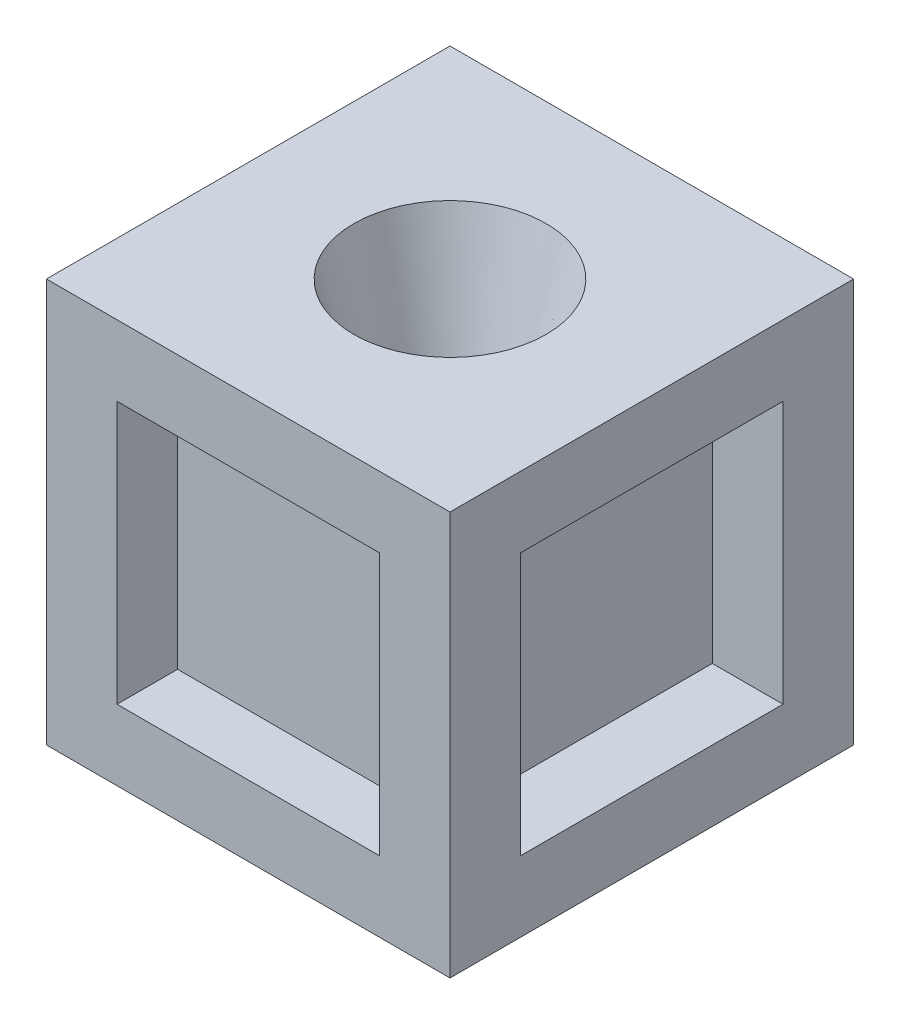
ISO-10303-21;
HEADER;
FILE_DESCRIPTION(('STEP AP214'),'2;1');
FILE_NAME('part.step','',(''),(''),'','','');
FILE_SCHEMA(('AUTOMOTIVE_DESIGN { 1 0 10303 214 1 1 1 1 }'));
ENDSEC;
DATA;
#1=APPLICATION_CONTEXT('core data for automotive mechanical design processes');
#2=APPLICATION_PROTOCOL_DEFINITION('international standard','automotive_design',2000,#1);
#3=PRODUCT_CONTEXT('',#1,'mechanical');
#4=PRODUCT('Part','Part','',(#3));
#5=PRODUCT_RELATED_PRODUCT_CATEGORY('part','',(#4));
#6=PRODUCT_DEFINITION_FORMATION('','',#4);
#7=PRODUCT_DEFINITION_CONTEXT('part definition',#1,'design');
#8=PRODUCT_DEFINITION('design','',#6,#7);
#9=PRODUCT_DEFINITION_SHAPE('','',#8);
#10=(LENGTH_UNIT() NAMED_UNIT(*) SI_UNIT(.MILLI.,.METRE.));
#11=(NAMED_UNIT(*) PLANE_ANGLE_UNIT() SI_UNIT($,.RADIAN.));
#12=(NAMED_UNIT(*) SI_UNIT($,.STERADIAN.) SOLID_ANGLE_UNIT());
#13=UNCERTAINTY_MEASURE_WITH_UNIT(LENGTH_MEASURE(1.E-05),#10,'distance_accuracy_value','');
#14=(GEOMETRIC_REPRESENTATION_CONTEXT(3) GLOBAL_UNCERTAINTY_ASSIGNED_CONTEXT((#13)) GLOBAL_UNIT_ASSIGNED_CONTEXT((#10,
#11,#12)) REPRESENTATION_CONTEXT('',''));
#15=CARTESIAN_POINT('',(0.,0.,0.));
#16=DIRECTION('',(0.,0.,1.));
#17=DIRECTION('',(1.,0.,0.));
#18=AXIS2_PLACEMENT_3D('',#15,#16,#17);
#19=CARTESIAN_POINT('',(-33.7032003820875,40.,8.10068404045491));
#20=DIRECTION('',(1.,0.,0.));
#21=DIRECTION('',(0.,0.,-1.));
#22=AXIS2_PLACEMENT_3D('',#19,#20,#21);
#23=PLANE('',#22);
#24=DIRECTION('',(0.,0.,-1.));
#25=VECTOR('',#24,1.);
#26=CARTESIAN_POINT('',(-33.7032003820875,33.,41.1006840404549));
#27=LINE('',#26,#25);
#28=CARTESIAN_POINT('',(-33.7032003820875,33.,41.1006840404549));
#29=VERTEX_POINT('',#28);
#30=CARTESIAN_POINT('',(-33.7032003820875,33.,15.1006840404549));
#31=VERTEX_POINT('',#30);
#32=EDGE_CURVE('E288',#29,#31,#27,.T.);
#33=ORIENTED_EDGE('',*,*,#32,.F.);
#34=DIRECTION('',(0.,1.,0.));
#35=VECTOR('',#34,1.);
#36=CARTESIAN_POINT('',(-33.7032003820875,33.,41.1006840404549));
#37=LINE('',#36,#35);
#38=CARTESIAN_POINT('',(-33.7032003820875,7.,41.1006840404549));
#39=VERTEX_POINT('',#38);
#40=EDGE_CURVE('E266',#39,#29,#37,.T.);
#41=ORIENTED_EDGE('',*,*,#40,.F.);
#42=DIRECTION('',(0.,0.,1.));
#43=VECTOR('',#42,1.);
#44=CARTESIAN_POINT('',(-33.7032003820875,7.,41.1006840404549));
#45=LINE('',#44,#43);
#46=CARTESIAN_POINT('',(-33.7032003820875,7.,15.1006840404549));
#47=VERTEX_POINT('',#46);
#48=EDGE_CURVE('E277',#47,#39,#45,.T.);
#49=ORIENTED_EDGE('',*,*,#48,.F.);
#50=DIRECTION('',(0.,-1.,0.));
#51=VECTOR('',#50,1.);
#52=CARTESIAN_POINT('',(-33.7032003820875,33.,15.1006840404549));
#53=LINE('',#52,#51);
#54=EDGE_CURVE('E291',#31,#47,#53,.T.);
#55=ORIENTED_EDGE('',*,*,#54,.F.);
#56=EDGE_LOOP('',(#33,#41,#49,#55));
#57=FACE_BOUND('',#56,.T.);
#58=DIRECTION('',(0.,0.,1.));
#59=VECTOR('',#58,1.);
#60=CARTESIAN_POINT('',(-33.7032003820875,0.,8.10068404045491));
#61=LINE('',#60,#59);
#62=CARTESIAN_POINT('',(-33.7032003820875,0.,8.10068404045491));
#63=VERTEX_POINT('',#62);
#64=CARTESIAN_POINT('',(-33.7032003820875,0.,48.1006840404549));
#65=VERTEX_POINT('',#64);
#66=EDGE_CURVE('E307',#63,#65,#61,.T.);
#67=ORIENTED_EDGE('',*,*,#66,.T.);
#68=DIRECTION('',(0.,-1.,0.));
#69=VECTOR('',#68,1.);
#70=CARTESIAN_POINT('',(-33.7032003820875,40.,48.1006840404549));
#71=LINE('',#70,#69);
#72=CARTESIAN_POINT('',(-33.7032003820875,40.,48.1006840404549));
#73=VERTEX_POINT('',#72);
#74=EDGE_CURVE('E334',#73,#65,#71,.T.);
#75=ORIENTED_EDGE('',*,*,#74,.F.);
#76=DIRECTION('',(0.,0.,1.));
#77=VECTOR('',#76,1.);
#78=CARTESIAN_POINT('',(-33.7032003820875,40.,8.10068404045491));
#79=LINE('',#78,#77);
#80=CARTESIAN_POINT('',(-33.7032003820875,40.,8.10068404045491));
#81=VERTEX_POINT('',#80);
#82=EDGE_CURVE('E308',#81,#73,#79,.T.);
#83=ORIENTED_EDGE('',*,*,#82,.F.);
#84=DIRECTION('',(0.,-1.,0.));
#85=VECTOR('',#84,1.);
#86=CARTESIAN_POINT('',(-33.7032003820875,40.,8.10068404045491));
#87=LINE('',#86,#85);
#88=EDGE_CURVE('E318',#81,#63,#87,.T.);
#89=ORIENTED_EDGE('',*,*,#88,.T.);
#90=EDGE_LOOP('',(#67,#75,#83,#89));
#91=FACE_BOUND('',#90,.T.);
#92=ADVANCED_FACE('F35',(#57,#91),#23,.F.);
#93=CARTESIAN_POINT('',(-33.7032003820875,40.,48.1006840404549));
#94=DIRECTION('',(0.,0.,-1.));
#95=DIRECTION('',(-1.,0.,0.));
#96=AXIS2_PLACEMENT_3D('',#93,#94,#95);
#97=PLANE('',#96);
#98=DIRECTION('',(1.,0.,0.));
#99=VECTOR('',#98,1.);
#100=CARTESIAN_POINT('',(-26.7032003820875,7.,48.1006840404549));
#101=LINE('',#100,#99);
#102=CARTESIAN_POINT('',(-26.7032003820875,7.,48.1006840404549));
#103=VERTEX_POINT('',#102);
#104=CARTESIAN_POINT('',(-0.703200382087463,7.,48.1006840404549));
#105=VERTEX_POINT('',#104);
#106=EDGE_CURVE('E225',#103,#105,#101,.T.);
#107=ORIENTED_EDGE('',*,*,#106,.F.);
#108=DIRECTION('',(0.,-1.,0.));
#109=VECTOR('',#108,1.);
#110=CARTESIAN_POINT('',(-26.7032003820875,33.,48.1006840404549));
#111=LINE('',#110,#109);
#112=CARTESIAN_POINT('',(-26.7032003820875,33.,48.1006840404549));
#113=VERTEX_POINT('',#112);
#114=EDGE_CURVE('E58',#113,#103,#111,.T.);
#115=ORIENTED_EDGE('',*,*,#114,.F.);
#116=DIRECTION('',(-1.,0.,0.));
#117=VECTOR('',#116,1.);
#118=CARTESIAN_POINT('',(-26.7032003820875,33.,48.1006840404549));
#119=LINE('',#118,#117);
#120=CARTESIAN_POINT('',(-0.703200382087467,33.,48.1006840404549));
#121=VERTEX_POINT('',#120);
#122=EDGE_CURVE('E214',#121,#113,#119,.T.);
#123=ORIENTED_EDGE('',*,*,#122,.F.);
#124=DIRECTION('',(0.,1.,0.));
#125=VECTOR('',#124,1.);
#126=CARTESIAN_POINT('',(-0.703200382087467,33.,48.1006840404549));
#127=LINE('',#126,#125);
#128=EDGE_CURVE('E228',#105,#121,#127,.T.);
#129=ORIENTED_EDGE('',*,*,#128,.F.);
#130=EDGE_LOOP('',(#107,#115,#123,#129));
#131=FACE_BOUND('',#130,.T.);
#132=DIRECTION('',(1.,0.,0.));
#133=VECTOR('',#132,1.);
#134=CARTESIAN_POINT('',(-33.7032003820875,0.,48.1006840404549));
#135=LINE('',#134,#133);
#136=CARTESIAN_POINT('',(6.29679961791253,0.,48.1006840404549));
#137=VERTEX_POINT('',#136);
#138=EDGE_CURVE('E321',#65,#137,#135,.T.);
#139=ORIENTED_EDGE('',*,*,#138,.T.);
#140=DIRECTION('',(0.,-1.,0.));
#141=VECTOR('',#140,1.);
#142=CARTESIAN_POINT('',(6.29679961791253,40.,48.1006840404549));
#143=LINE('',#142,#141);
#144=CARTESIAN_POINT('',(6.29679961791253,40.,48.1006840404549));
#145=VERTEX_POINT('',#144);
#146=EDGE_CURVE('E331',#145,#137,#143,.T.);
#147=ORIENTED_EDGE('',*,*,#146,.F.);
#148=DIRECTION('',(1.,0.,0.));
#149=VECTOR('',#148,1.);
#150=CARTESIAN_POINT('',(-33.7032003820875,40.,48.1006840404549));
#151=LINE('',#150,#149);
#152=EDGE_CURVE('E311',#73,#145,#151,.T.);
#153=ORIENTED_EDGE('',*,*,#152,.F.);
#154=ORIENTED_EDGE('',*,*,#74,.T.);
#155=EDGE_LOOP('',(#139,#147,#153,#154));
#156=FACE_BOUND('',#155,.T.);
#157=ADVANCED_FACE('F356',(#131,#156),#97,.F.);
#158=CARTESIAN_POINT('',(6.29679961791253,40.,8.10068404045491));
#159=DIRECTION('',(-1.,0.,0.));
#160=DIRECTION('',(0.,0.,1.));
#161=AXIS2_PLACEMENT_3D('',#158,#159,#160);
#162=PLANE('',#161);
#163=DIRECTION('',(0.,0.,-1.));
#164=VECTOR('',#163,1.);
#165=CARTESIAN_POINT('',(6.29679961791253,7.,41.1006840404549));
#166=LINE('',#165,#164);
#167=CARTESIAN_POINT('',(6.29679961791253,7.,41.1006840404549));
#168=VERTEX_POINT('',#167);
#169=CARTESIAN_POINT('',(6.29679961791253,7.,15.1006840404549));
#170=VERTEX_POINT('',#169);
#171=EDGE_CURVE('E201',#168,#170,#166,.T.);
#172=ORIENTED_EDGE('',*,*,#171,.F.);
#173=DIRECTION('',(0.,-1.,0.));
#174=VECTOR('',#173,1.);
#175=CARTESIAN_POINT('',(6.29679961791253,33.,41.1006840404549));
#176=LINE('',#175,#174);
#177=CARTESIAN_POINT('',(6.29679961791253,33.,41.1006840404549));
#178=VERTEX_POINT('',#177);
#179=EDGE_CURVE('E50',#178,#168,#176,.T.);
#180=ORIENTED_EDGE('',*,*,#179,.F.);
#181=DIRECTION('',(0.,0.,1.));
#182=VECTOR('',#181,1.);
#183=CARTESIAN_POINT('',(6.29679961791253,33.,41.1006840404549));
#184=LINE('',#183,#182);
#185=CARTESIAN_POINT('',(6.29679961791253,33.,15.1006840404549));
#186=VERTEX_POINT('',#185);
#187=EDGE_CURVE('E192',#186,#178,#184,.T.);
#188=ORIENTED_EDGE('',*,*,#187,.F.);
#189=DIRECTION('',(0.,1.,0.));
#190=VECTOR('',#189,1.);
#191=CARTESIAN_POINT('',(6.29679961791253,33.,15.1006840404549));
#192=LINE('',#191,#190);
#193=EDGE_CURVE('E195',#170,#186,#192,.T.);
#194=ORIENTED_EDGE('',*,*,#193,.F.);
#195=EDGE_LOOP('',(#172,#180,#188,#194));
#196=FACE_BOUND('',#195,.T.);
#197=DIRECTION('',(0.,0.,-1.));
#198=VECTOR('',#197,1.);
#199=CARTESIAN_POINT('',(6.29679961791253,0.,8.10068404045491));
#200=LINE('',#199,#198);
#201=CARTESIAN_POINT('',(6.29679961791253,0.,8.10068404045491));
#202=VERTEX_POINT('',#201);
#203=EDGE_CURVE('E323',#137,#202,#200,.T.);
#204=ORIENTED_EDGE('',*,*,#203,.T.);
#205=DIRECTION('',(0.,-1.,0.));
#206=VECTOR('',#205,1.);
#207=CARTESIAN_POINT('',(6.29679961791253,40.,8.10068404045491));
#208=LINE('',#207,#206);
#209=CARTESIAN_POINT('',(6.29679961791253,40.,8.10068404045491));
#210=VERTEX_POINT('',#209);
#211=EDGE_CURVE('E328',#210,#202,#208,.T.);
#212=ORIENTED_EDGE('',*,*,#211,.F.);
#213=DIRECTION('',(0.,0.,-1.));
#214=VECTOR('',#213,1.);
#215=CARTESIAN_POINT('',(6.29679961791253,40.,8.10068404045491));
#216=LINE('',#215,#214);
#217=EDGE_CURVE('E314',#145,#210,#216,.T.);
#218=ORIENTED_EDGE('',*,*,#217,.F.);
#219=ORIENTED_EDGE('',*,*,#146,.T.);
#220=EDGE_LOOP('',(#204,#212,#218,#219));
#221=FACE_BOUND('',#220,.T.);
#222=ADVANCED_FACE('F361',(#196,#221),#162,.F.);
#223=CARTESIAN_POINT('',(-33.7032003820875,40.,8.10068404045491));
#224=DIRECTION('',(0.,0.,1.));
#225=DIRECTION('',(1.,0.,0.));
#226=AXIS2_PLACEMENT_3D('',#223,#224,#225);
#227=PLANE('',#226);
#228=DIRECTION('',(-1.,0.,0.));
#229=VECTOR('',#228,1.);
#230=CARTESIAN_POINT('',(-0.703200382087478,7.,8.10068404045491));
#231=LINE('',#230,#229);
#232=CARTESIAN_POINT('',(-0.703200382087481,7.,8.10068404045491));
#233=VERTEX_POINT('',#232);
#234=CARTESIAN_POINT('',(-26.7032003820875,7.,8.10068404045491));
#235=VERTEX_POINT('',#234);
#236=EDGE_CURVE('E256',#233,#235,#231,.T.);
#237=ORIENTED_EDGE('',*,*,#236,.F.);
#238=DIRECTION('',(0.,-1.,0.));
#239=VECTOR('',#238,1.);
#240=CARTESIAN_POINT('',(-0.703200382087474,33.,8.10068404045491));
#241=LINE('',#240,#239);
#242=CARTESIAN_POINT('',(-0.703200382087474,33.,8.10068404045491));
#243=VERTEX_POINT('',#242);
#244=EDGE_CURVE('E235',#243,#233,#241,.T.);
#245=ORIENTED_EDGE('',*,*,#244,.F.);
#246=DIRECTION('',(1.,0.,0.));
#247=VECTOR('',#246,1.);
#248=CARTESIAN_POINT('',(-0.703200382087474,33.,8.10068404045491));
#249=LINE('',#248,#247);
#250=CARTESIAN_POINT('',(-26.7032003820875,33.,8.10068404045491));
#251=VERTEX_POINT('',#250);
#252=EDGE_CURVE('E245',#251,#243,#249,.T.);
#253=ORIENTED_EDGE('',*,*,#252,.F.);
#254=DIRECTION('',(0.,1.,0.));
#255=VECTOR('',#254,1.);
#256=CARTESIAN_POINT('',(-26.7032003820875,33.,8.10068404045491));
#257=LINE('',#256,#255);
#258=EDGE_CURVE('E259',#235,#251,#257,.T.);
#259=ORIENTED_EDGE('',*,*,#258,.F.);
#260=EDGE_LOOP('',(#237,#245,#253,#259));
#261=FACE_BOUND('',#260,.T.);
#262=DIRECTION('',(-1.,0.,0.));
#263=VECTOR('',#262,1.);
#264=CARTESIAN_POINT('',(-33.7032003820875,0.,8.10068404045491));
#265=LINE('',#264,#263);
#266=EDGE_CURVE('E312',#202,#63,#265,.T.);
#267=ORIENTED_EDGE('',*,*,#266,.T.);
#268=ORIENTED_EDGE('',*,*,#88,.F.);
#269=DIRECTION('',(-1.,0.,0.));
#270=VECTOR('',#269,1.);
#271=CARTESIAN_POINT('',(-33.7032003820875,40.,8.10068404045491));
#272=LINE('',#271,#270);
#273=EDGE_CURVE('E316',#210,#81,#272,.T.);
#274=ORIENTED_EDGE('',*,*,#273,.F.);
#275=ORIENTED_EDGE('',*,*,#211,.T.);
#276=EDGE_LOOP('',(#267,#268,#274,#275));
#277=FACE_BOUND('',#276,.T.);
#278=ADVANCED_FACE('F369',(#261,#277),#227,.F.);
#279=CARTESIAN_POINT('',(0.,40.,0.));
#280=DIRECTION('',(0.,1.,0.));
#281=DIRECTION('',(0.,0.,1.));
#282=AXIS2_PLACEMENT_3D('',#279,#280,#281);
#283=PLANE('',#282);
#284=CARTESIAN_POINT('',(-13.7032003820875,40.,28.1006840404549));
#285=DIRECTION('',(0.,1.,0.));
#286=DIRECTION('',(0.,0.,1.));
#287=AXIS2_PLACEMENT_3D('',#284,#285,#286);
#288=CIRCLE('',#287,9.523);
#289=CARTESIAN_POINT('',(-11.144198006995,40.,18.92795075946));
#290=VERTEX_POINT('',#289);
#291=EDGE_CURVE('E298',#290,#290,#288,.T.);
#292=ORIENTED_EDGE('',*,*,#291,.F.);
#293=EDGE_LOOP('',(#292));
#294=FACE_BOUND('',#293,.T.);
#295=ORIENTED_EDGE('',*,*,#82,.T.);
#296=ORIENTED_EDGE('',*,*,#152,.T.);
#297=ORIENTED_EDGE('',*,*,#217,.T.);
#298=ORIENTED_EDGE('',*,*,#273,.T.);
#299=EDGE_LOOP('',(#295,#296,#297,#298));
#300=FACE_BOUND('',#299,.T.);
#301=ADVANCED_FACE('F373',(#294,#300),#283,.T.);
#302=CARTESIAN_POINT('',(0.,0.,0.));
#303=DIRECTION('',(0.,1.,0.));
#304=DIRECTION('',(0.,0.,1.));
#305=AXIS2_PLACEMENT_3D('',#302,#303,#304);
#306=PLANE('',#305);
#307=ORIENTED_EDGE('',*,*,#66,.F.);
#308=ORIENTED_EDGE('',*,*,#266,.F.);
#309=ORIENTED_EDGE('',*,*,#203,.F.);
#310=ORIENTED_EDGE('',*,*,#138,.F.);
#311=EDGE_LOOP('',(#307,#308,#309,#310));
#312=FACE_BOUND('',#311,.T.);
#313=ADVANCED_FACE('F375',(#312),#306,.F.);
#314=CARTESIAN_POINT('',(-13.7032003820875,11.42,28.1006840404549));
#315=DIRECTION('',(0.,1.,0.));
#316=DIRECTION('',(0.,0.,1.));
#317=AXIS2_PLACEMENT_3D('',#314,#315,#316);
#318=PLANE('',#317);
#319=CARTESIAN_POINT('',(-13.7032003820875,11.42,28.1006840404549));
#320=DIRECTION('',(0.,1.,0.));
#321=DIRECTION('',(0.,0.,1.));
#322=AXIS2_PLACEMENT_3D('',#319,#320,#321);
#323=CIRCLE('',#322,2.57064720895704);
#324=CARTESIAN_POINT('',(-13.7032003820875,11.42,30.671331249412));
#325=VERTEX_POINT('',#324);
#326=EDGE_CURVE('E43',#325,#325,#323,.T.);
#327=ORIENTED_EDGE('',*,*,#326,.T.);
#328=EDGE_LOOP('',(#327));
#329=FACE_BOUND('',#328,.T.);
#330=ADVANCED_FACE('F339',(#329),#318,.T.);
#331=CARTESIAN_POINT('',(-11.144198006995,40.,18.92795075946));
#332=CARTESIAN_POINT('',(-10.3806718388359,11.42,27.0003186105731));
#333=CARTESIAN_POINT('',(7.20126855499477,40.,24.045955509645));
#334=CARTESIAN_POINT('',(-8.17994097907239,11.42,33.6453756970762));
#335=CARTESIAN_POINT('',(2.08326380480977,40.,42.3914220716348));
#336=CARTESIAN_POINT('',(-14.8249980655754,11.42,35.8461065568397));
#337=CARTESIAN_POINT('',(-16.26220275718,40.,37.2734173214498));
#338=CARTESIAN_POINT('',(-17.025728925339,11.42,29.2010494703367));
#339=CARTESIAN_POINT('',(-34.6076693191697,40.,32.1554125712648));
#340=CARTESIAN_POINT('',(-19.2264597851025,11.42,22.5559923838337));
#341=CARTESIAN_POINT('',(-29.4896645689847,40.,13.809946009275));
#342=CARTESIAN_POINT('',(-12.5814026985995,11.42,20.3552615240701));
#343=CARTESIAN_POINT('',(-11.144198006995,40.,18.92795075946));
#344=CARTESIAN_POINT('',(-10.3806718388359,11.42,27.0003186105731));
#345=(BOUNDED_SURFACE() B_SPLINE_SURFACE(3,1,((#331,#332),(#333,#334),(#335,#336),(#337,#338),
(#339,#340),(#341,#342),(#343,#344)),.UNSPECIFIED.,.T.,.F.,.F.) B_SPLINE_SURFACE_WITH_KNOTS((4,
3,4),(2,2),(0.,0.5,1.),(0.,1.),
.UNSPECIFIED.) GEOMETRIC_REPRESENTATION_ITEM() RATIONAL_B_SPLINE_SURFACE(((1.,1.),
(0.333333333333333,0.333333333333333),(0.333333333333333,0.333333333333333),(1.,1.),
(0.333333333333334,0.333333333333334),(0.333333333333334,0.333333333333334),(1.,1.))) REPRESENTATION_ITEM('') SURFACE());
#346=CARTESIAN_POINT('',(-13.7032003820875,12.3373423340125,28.1006840404549));
#347=DIRECTION('',(0.,-1.,0.));
#348=DIRECTION('',(0.,0.,-1.));
#349=AXIS2_PLACEMENT_3D('',#346,#347,#348);
#350=CIRCLE('',#349,3.5672252090421);
#351=CARTESIAN_POINT('',(-10.4051790073866,12.3373423340125,26.7412169742698));
#352=VERTEX_POINT('',#351);
#353=EDGE_CURVE('E12',#352,#352,#350,.T.);
#354=CARTESIAN_POINT('',(-10.4051790073866,12.3373423340125,26.7412169742698));
#355=CARTESIAN_POINT('',(-10.4128771219659,12.6254950180332,26.6598287845322));
#356=CARTESIAN_POINT('',(-10.4205752365451,12.9136477020539,26.5784405947946));
#357=CARTESIAN_POINT('',(-10.4359714657036,13.4899530700954,26.4156642153194));
#358=CARTESIAN_POINT('',(-10.4436695802829,13.7781057541161,26.3342760255818));
#359=CARTESIAN_POINT('',(-10.4590658094414,14.3544111221575,26.1714996461066));
#360=CARTESIAN_POINT('',(-10.4667639240207,14.6425638061782,26.090111456369));
#361=CARTESIAN_POINT('',(-10.4821601531792,15.2188691742196,25.9273350768938));
#362=CARTESIAN_POINT('',(-10.4898582677584,15.5070218582403,25.8459468871562));
#363=CARTESIAN_POINT('',(-10.5052544969169,16.0833272262817,25.683170507681));
#364=CARTESIAN_POINT('',(-10.5129526114962,16.3714799103024,25.6017823179434));
#365=CARTESIAN_POINT('',(-10.5283488406547,16.9477852783438,25.4390059384682));
#366=CARTESIAN_POINT('',(-10.5360469552339,17.2359379623645,25.3576177487306));
#367=CARTESIAN_POINT('',(-10.5514431843925,17.8122433304059,25.1948413692554));
#368=CARTESIAN_POINT('',(-10.5591412989717,18.1003960144266,25.1134531795178));
#369=CARTESIAN_POINT('',(-10.5745375281302,18.676701382468,24.9506768000426));
#370=CARTESIAN_POINT('',(-10.5822356427095,18.9648540664887,24.869288610305));
#371=CARTESIAN_POINT('',(-10.597631871868,19.5411594345301,24.7065122308298));
#372=CARTESIAN_POINT('',(-10.6053299864472,19.8293121185508,24.6251240410922));
#373=CARTESIAN_POINT('',(-10.6207262156057,20.4056174865922,24.462347661617));
#374=CARTESIAN_POINT('',(-10.628424330185,20.6937701706129,24.3809594718794));
#375=CARTESIAN_POINT('',(-10.6438205593435,21.2700755386543,24.2181830924042));
#376=CARTESIAN_POINT('',(-10.6515186739227,21.558228222675,24.1367949026666));
#377=CARTESIAN_POINT('',(-10.6669149030813,22.1345335907164,23.9740185231914));
#378=CARTESIAN_POINT('',(-10.6746130176605,22.4226862747371,23.8926303334538));
#379=CARTESIAN_POINT('',(-10.690009246819,22.9989916427785,23.7298539539786));
#380=CARTESIAN_POINT('',(-10.6977073613983,23.2871443267992,23.648465764241));
#381=CARTESIAN_POINT('',(-10.7131035905568,23.8634496948407,23.4856893847658));
#382=CARTESIAN_POINT('',(-10.720801705136,24.1516023788614,23.4043011950282));
#383=CARTESIAN_POINT('',(-10.7361979342945,24.7279077469028,23.2415248155529));
#384=CARTESIAN_POINT('',(-10.7438960488738,25.0160604309235,23.1601366258153));
#385=CARTESIAN_POINT('',(-10.7592922780323,25.5923657989649,22.9973602463401));
#386=CARTESIAN_POINT('',(-10.7669903926115,25.8805184829856,22.9159720566025));
#387=CARTESIAN_POINT('',(-10.7823866217701,26.456823851027,22.7531956771273));
#388=CARTESIAN_POINT('',(-10.7900847363493,26.7449765350477,22.6718074873897));
#389=CARTESIAN_POINT('',(-10.8054809655078,27.3212819030891,22.5090311079145));
#390=CARTESIAN_POINT('',(-10.8131790800871,27.6094345871098,22.4276429181769));
#391=CARTESIAN_POINT('',(-10.8285753092456,28.1857399551512,22.2648665387017));
#392=CARTESIAN_POINT('',(-10.8362734238248,28.4738926391719,22.1834783489641));
#393=CARTESIAN_POINT('',(-10.8516696529833,29.0501980072133,22.0207019694889));
#394=CARTESIAN_POINT('',(-10.8593677675626,29.338350691234,21.9393137797513));
#395=CARTESIAN_POINT('',(-10.8747639967211,29.9146560592754,21.7765374002761));
#396=CARTESIAN_POINT('',(-10.8824621113003,30.2028087432961,21.6951492105385));
#397=CARTESIAN_POINT('',(-10.8978583404589,30.7791141113375,21.5323728310633));
#398=CARTESIAN_POINT('',(-10.9055564550381,31.0672667953582,21.4509846413257));
#399=CARTESIAN_POINT('',(-10.9209526841966,31.6435721633996,21.2882082618505));
#400=CARTESIAN_POINT('',(-10.9286507987759,31.9317248474203,21.2068200721129));
#401=CARTESIAN_POINT('',(-10.9440470279344,32.5080302154617,21.0440436926377));
#402=CARTESIAN_POINT('',(-10.9517451425136,32.7961828994824,20.9626555029001));
#403=CARTESIAN_POINT('',(-10.9671413716721,33.3724882675238,20.7998791234249));
#404=CARTESIAN_POINT('',(-10.9748394862514,33.6606409515445,20.7184909336873));
#405=CARTESIAN_POINT('',(-10.9902357154099,34.2369463195859,20.5557145542121));
#406=CARTESIAN_POINT('',(-10.9979338299891,34.5250990036067,20.4743263644745));
#407=CARTESIAN_POINT('',(-11.0133300591477,35.1014043716481,20.3115499849993));
#408=CARTESIAN_POINT('',(-11.0210281737269,35.3895570556688,20.2301617952617));
#409=CARTESIAN_POINT('',(-11.0364244028854,35.9658624237102,20.0673854157865));
#410=CARTESIAN_POINT('',(-11.0441225174647,36.2540151077309,19.9859972260489));
#411=CARTESIAN_POINT('',(-11.0595187466232,36.8303204757723,19.8232208465737));
#412=CARTESIAN_POINT('',(-11.0672168612024,37.118473159793,19.7418326568361));
#413=CARTESIAN_POINT('',(-11.0826130903609,37.6947785278344,19.5790562773609));
#414=CARTESIAN_POINT('',(-11.0903112049402,37.9829312118551,19.4976680876232));
#415=CARTESIAN_POINT('',(-11.1057074340987,38.5592365798965,19.334891708148));
#416=CARTESIAN_POINT('',(-11.113405548678,38.8473892639172,19.2535035184104));
#417=CARTESIAN_POINT('',(-11.1288017778365,39.4236946319586,19.0907271389352));
#418=CARTESIAN_POINT('',(-11.1364998924157,39.7118473159793,19.0093389491976));
#419=CARTESIAN_POINT('',(-11.144198006995,40.,18.92795075946));
#420=B_SPLINE_CURVE_WITH_KNOTS('',3,(#354,#355,#356,#357,#358,#359,#360,#361,#362,#363,#364,
#365,#366,#367,#368,#369,#370,#371,#372,#373,#374,#375,#376,#377,#378,#379,#380,#381,#382,#383,
#384,#385,#386,#387,#388,#389,#390,#391,#392,#393,#394,#395,#396,#397,#398,#399,#400,#401,#402,
#403,#404,#405,#406,#407,#408,#409,#410,#411,#412,#413,#414,#415,#416,#417,#418,#419),
.UNSPECIFIED.,.F.,.F.,(4,2,2,2,2,2,2,2,2,2,2,2,2,2,2,2,2,2,2,2,2,2,2,2,2,2,2,2,2,2,2,2,4),(0.,
0.898575210734509,1.79715042146902,2.69572563220353,3.59430084293804,4.49287605367255,
5.39145126440706,6.29002647514156,7.18860168587608,8.08717689661058,8.98575210734509,
9.8843273180796,10.7829025288141,11.6814777395486,12.5800529502831,13.4786281610176,
14.3772033717522,15.2757785824867,16.1743537932212,17.0729290039557,17.9715042146902,
18.8700794254247,19.7686546361592,20.6672298468937,21.5658050576282,22.4643802683627,
23.3629554790973,24.2615306898318,25.1601059005663,26.0586811113008,26.9572563220353,
27.8558315327698,28.7544067435043),.UNSPECIFIED.);
#421=EDGE_CURVE('BSEAM343',#352,#290,#420,.T.);
#422=ORIENTED_EDGE('',*,*,#353,.T.);
#423=ORIENTED_EDGE('',*,*,#291,.T.);
#424=ORIENTED_EDGE('',*,*,#421,.T.);
#425=ORIENTED_EDGE('',*,*,#421,.F.);
#426=EDGE_LOOP('',(#422,#424,#423,#425));
#427=FACE_BOUND('',#426,.T.);
#428=ADVANCED_FACE('F343',(#427),#345,.F.);
#429=CARTESIAN_POINT('',(-13.7032003820875,12.42,28.1006840404549));
#430=DIRECTION('',(0.,-1.,0.));
#431=DIRECTION('',(0.,0.,-1.));
#432=AXIS2_PLACEMENT_3D('',#429,#430,#431);
#433=TOROIDAL_SURFACE('',#432,2.57064720895704,1.);
#434=ORIENTED_EDGE('',*,*,#353,.F.);
#435=EDGE_LOOP('',(#434));
#436=FACE_BOUND('',#435,.T.);
#437=ORIENTED_EDGE('',*,*,#326,.F.);
#438=EDGE_LOOP('',(#437));
#439=FACE_BOUND('',#438,.T.);
#440=ADVANCED_FACE('F37',(#436,#439),#433,.F.);
#441=CARTESIAN_POINT('',(-26.7032003820875,33.,41.1006840404549));
#442=DIRECTION('',(0.,0.,1.));
#443=DIRECTION('',(1.,0.,0.));
#444=AXIS2_PLACEMENT_3D('',#441,#442,#443);
#445=PLANE('',#444);
#446=ORIENTED_EDGE('',*,*,#40,.T.);
#447=DIRECTION('',(-1.,0.,0.));
#448=VECTOR('',#447,1.);
#449=CARTESIAN_POINT('',(-26.7032003820875,33.,41.1006840404549));
#450=LINE('',#449,#448);
#451=CARTESIAN_POINT('',(-26.7032003820875,33.,41.1006840404549));
#452=VERTEX_POINT('',#451);
#453=EDGE_CURVE('E286',#452,#29,#450,.T.);
#454=ORIENTED_EDGE('',*,*,#453,.F.);
#455=DIRECTION('',(0.,1.,0.));
#456=VECTOR('',#455,1.);
#457=CARTESIAN_POINT('',(-26.7032003820875,33.,41.1006840404549));
#458=LINE('',#457,#456);
#459=CARTESIAN_POINT('',(-26.7032003820875,7.,41.1006840404549));
#460=VERTEX_POINT('',#459);
#461=EDGE_CURVE('E273',#460,#452,#458,.T.);
#462=ORIENTED_EDGE('',*,*,#461,.F.);
#463=DIRECTION('',(-1.,0.,0.));
#464=VECTOR('',#463,1.);
#465=CARTESIAN_POINT('',(-26.7032003820875,7.,41.1006840404549));
#466=LINE('',#465,#464);
#467=EDGE_CURVE('E296',#460,#39,#466,.T.);
#468=ORIENTED_EDGE('',*,*,#467,.T.);
#469=EDGE_LOOP('',(#446,#454,#462,#468));
#470=FACE_BOUND('',#469,.T.);
#471=ADVANCED_FACE('F342',(#470),#445,.F.);
#472=CARTESIAN_POINT('',(-26.7032003820875,7.,41.1006840404549));
#473=DIRECTION('',(0.,-1.,0.));
#474=DIRECTION('',(0.,0.,-1.));
#475=AXIS2_PLACEMENT_3D('',#472,#473,#474);
#476=PLANE('',#475);
#477=ORIENTED_EDGE('',*,*,#48,.T.);
#478=ORIENTED_EDGE('',*,*,#467,.F.);
#479=DIRECTION('',(0.,0.,1.));
#480=VECTOR('',#479,1.);
#481=CARTESIAN_POINT('',(-26.7032003820875,7.,41.1006840404549));
#482=LINE('',#481,#480);
#483=CARTESIAN_POINT('',(-26.7032003820875,7.,15.1006840404549));
#484=VERTEX_POINT('',#483);
#485=EDGE_CURVE('E283',#484,#460,#482,.T.);
#486=ORIENTED_EDGE('',*,*,#485,.F.);
#487=DIRECTION('',(-1.,0.,0.));
#488=VECTOR('',#487,1.);
#489=CARTESIAN_POINT('',(-26.7032003820875,7.,15.1006840404549));
#490=LINE('',#489,#488);
#491=EDGE_CURVE('E299',#484,#47,#490,.T.);
#492=ORIENTED_EDGE('',*,*,#491,.T.);
#493=EDGE_LOOP('',(#477,#478,#486,#492));
#494=FACE_BOUND('',#493,.T.);
#495=ADVANCED_FACE('F349',(#494),#476,.F.);
#496=CARTESIAN_POINT('',(-26.7032003820875,33.,15.1006840404549));
#497=DIRECTION('',(0.,0.,-1.));
#498=DIRECTION('',(-1.,0.,0.));
#499=AXIS2_PLACEMENT_3D('',#496,#497,#498);
#500=PLANE('',#499);
#501=ORIENTED_EDGE('',*,*,#54,.T.);
#502=ORIENTED_EDGE('',*,*,#491,.F.);
#503=DIRECTION('',(0.,-1.,0.));
#504=VECTOR('',#503,1.);
#505=CARTESIAN_POINT('',(-26.7032003820875,33.,15.1006840404549));
#506=LINE('',#505,#504);
#507=CARTESIAN_POINT('',(-26.7032003820875,33.,15.1006840404549));
#508=VERTEX_POINT('',#507);
#509=EDGE_CURVE('E280',#508,#484,#506,.T.);
#510=ORIENTED_EDGE('',*,*,#509,.F.);
#511=DIRECTION('',(-1.,0.,0.));
#512=VECTOR('',#511,1.);
#513=CARTESIAN_POINT('',(-26.7032003820875,33.,15.1006840404549));
#514=LINE('',#513,#512);
#515=EDGE_CURVE('E301',#508,#31,#514,.T.);
#516=ORIENTED_EDGE('',*,*,#515,.T.);
#517=EDGE_LOOP('',(#501,#502,#510,#516));
#518=FACE_BOUND('',#517,.T.);
#519=ADVANCED_FACE('F395',(#518),#500,.F.);
#520=CARTESIAN_POINT('',(-26.7032003820875,33.,41.1006840404549));
#521=DIRECTION('',(0.,1.,0.));
#522=DIRECTION('',(0.,0.,1.));
#523=AXIS2_PLACEMENT_3D('',#520,#521,#522);
#524=PLANE('',#523);
#525=ORIENTED_EDGE('',*,*,#32,.T.);
#526=ORIENTED_EDGE('',*,*,#515,.F.);
#527=DIRECTION('',(0.,0.,-1.));
#528=VECTOR('',#527,1.);
#529=CARTESIAN_POINT('',(-26.7032003820875,33.,41.1006840404549));
#530=LINE('',#529,#528);
#531=EDGE_CURVE('E276',#452,#508,#530,.T.);
#532=ORIENTED_EDGE('',*,*,#531,.F.);
#533=ORIENTED_EDGE('',*,*,#453,.T.);
#534=EDGE_LOOP('',(#525,#526,#532,#533));
#535=FACE_BOUND('',#534,.T.);
#536=ADVANCED_FACE('F391',(#535),#524,.F.);
#537=CARTESIAN_POINT('',(-26.7032003820875,0.,0.));
#538=DIRECTION('',(1.,0.,0.));
#539=DIRECTION('',(0.,0.,-1.));
#540=AXIS2_PLACEMENT_3D('',#537,#538,#539);
#541=PLANE('',#540);
#542=ORIENTED_EDGE('',*,*,#461,.T.);
#543=ORIENTED_EDGE('',*,*,#531,.T.);
#544=ORIENTED_EDGE('',*,*,#509,.T.);
#545=ORIENTED_EDGE('',*,*,#485,.T.);
#546=EDGE_LOOP('',(#542,#543,#544,#545));
#547=FACE_BOUND('',#546,.T.);
#548=ADVANCED_FACE('F394',(#547),#541,.F.);
#549=CARTESIAN_POINT('',(-0.703200382087474,33.,14.1006840404549));
#550=DIRECTION('',(1.,0.,0.));
#551=DIRECTION('',(0.,1.,0.));
#552=AXIS2_PLACEMENT_3D('',#549,#550,#551);
#553=PLANE('',#552);
#554=ORIENTED_EDGE('',*,*,#244,.T.);
#555=DIRECTION('',(0.,0.,-1.));
#556=VECTOR('',#555,1.);
#557=CARTESIAN_POINT('',(-0.703200382087478,7.,14.1006840404549));
#558=LINE('',#557,#556);
#559=CARTESIAN_POINT('',(-0.703200382087478,7.,14.1006840404549));
#560=VERTEX_POINT('',#559);
#561=EDGE_CURVE('E254',#560,#233,#558,.T.);
#562=ORIENTED_EDGE('',*,*,#561,.F.);
#563=DIRECTION('',(0.,-1.,0.));
#564=VECTOR('',#563,1.);
#565=CARTESIAN_POINT('',(-0.703200382087474,33.,14.1006840404549));
#566=LINE('',#565,#564);
#567=CARTESIAN_POINT('',(-0.703200382087474,33.,14.1006840404549));
#568=VERTEX_POINT('',#567);
#569=EDGE_CURVE('E241',#568,#560,#566,.T.);
#570=ORIENTED_EDGE('',*,*,#569,.F.);
#571=DIRECTION('',(0.,0.,-1.));
#572=VECTOR('',#571,1.);
#573=CARTESIAN_POINT('',(-0.703200382087474,33.,14.1006840404549));
#574=LINE('',#573,#572);
#575=EDGE_CURVE('E264',#568,#243,#574,.T.);
#576=ORIENTED_EDGE('',*,*,#575,.T.);
#577=EDGE_LOOP('',(#554,#562,#570,#576));
#578=FACE_BOUND('',#577,.T.);
#579=ADVANCED_FACE('F405',(#578),#553,.F.);
#580=CARTESIAN_POINT('',(-0.703200382087474,33.,14.1006840404549));
#581=DIRECTION('',(0.,1.,0.));
#582=DIRECTION('',(0.,0.,1.));
#583=AXIS2_PLACEMENT_3D('',#580,#581,#582);
#584=PLANE('',#583);
#585=ORIENTED_EDGE('',*,*,#252,.T.);
#586=ORIENTED_EDGE('',*,*,#575,.F.);
#587=DIRECTION('',(1.,0.,0.));
#588=VECTOR('',#587,1.);
#589=CARTESIAN_POINT('',(-0.703200382087474,33.,14.1006840404549));
#590=LINE('',#589,#588);
#591=CARTESIAN_POINT('',(-26.7032003820875,33.,14.1006840404549));
#592=VERTEX_POINT('',#591);
#593=EDGE_CURVE('E251',#592,#568,#590,.T.);
#594=ORIENTED_EDGE('',*,*,#593,.F.);
#595=DIRECTION('',(0.,0.,-1.));
#596=VECTOR('',#595,1.);
#597=CARTESIAN_POINT('',(-26.7032003820875,33.,14.1006840404549));
#598=LINE('',#597,#596);
#599=EDGE_CURVE('E267',#592,#251,#598,.T.);
#600=ORIENTED_EDGE('',*,*,#599,.T.);
#601=EDGE_LOOP('',(#585,#586,#594,#600));
#602=FACE_BOUND('',#601,.T.);
#603=ADVANCED_FACE('F409',(#602),#584,.F.);
#604=CARTESIAN_POINT('',(-26.7032003820875,33.,14.1006840404549));
#605=DIRECTION('',(-1.,0.,0.));
#606=DIRECTION('',(0.,-1.,0.));
#607=AXIS2_PLACEMENT_3D('',#604,#605,#606);
#608=PLANE('',#607);
#609=ORIENTED_EDGE('',*,*,#258,.T.);
#610=ORIENTED_EDGE('',*,*,#599,.F.);
#611=DIRECTION('',(0.,1.,0.));
#612=VECTOR('',#611,1.);
#613=CARTESIAN_POINT('',(-26.7032003820875,33.,14.1006840404549));
#614=LINE('',#613,#612);
#615=CARTESIAN_POINT('',(-26.7032003820875,7.,14.1006840404549));
#616=VERTEX_POINT('',#615);
#617=EDGE_CURVE('E248',#616,#592,#614,.T.);
#618=ORIENTED_EDGE('',*,*,#617,.F.);
#619=DIRECTION('',(0.,0.,-1.));
#620=VECTOR('',#619,1.);
#621=CARTESIAN_POINT('',(-26.7032003820875,7.,14.1006840404549));
#622=LINE('',#621,#620);
#623=EDGE_CURVE('E269',#616,#235,#622,.T.);
#624=ORIENTED_EDGE('',*,*,#623,.T.);
#625=EDGE_LOOP('',(#609,#610,#618,#624));
#626=FACE_BOUND('',#625,.T.);
#627=ADVANCED_FACE('F415',(#626),#608,.F.);
#628=CARTESIAN_POINT('',(-0.703200382087478,7.,14.1006840404549));
#629=DIRECTION('',(0.,-1.,0.));
#630=DIRECTION('',(0.,0.,-1.));
#631=AXIS2_PLACEMENT_3D('',#628,#629,#630);
#632=PLANE('',#631);
#633=ORIENTED_EDGE('',*,*,#236,.T.);
#634=ORIENTED_EDGE('',*,*,#623,.F.);
#635=DIRECTION('',(-1.,0.,0.));
#636=VECTOR('',#635,1.);
#637=CARTESIAN_POINT('',(-0.703200382087478,7.,14.1006840404549));
#638=LINE('',#637,#636);
#639=EDGE_CURVE('E244',#560,#616,#638,.T.);
#640=ORIENTED_EDGE('',*,*,#639,.F.);
#641=ORIENTED_EDGE('',*,*,#561,.T.);
#642=EDGE_LOOP('',(#633,#634,#640,#641));
#643=FACE_BOUND('',#642,.T.);
#644=ADVANCED_FACE('F411',(#643),#632,.F.);
#645=CARTESIAN_POINT('',(0.,0.,14.1006840404549));
#646=DIRECTION('',(0.,0.,-1.));
#647=DIRECTION('',(-1.,0.,0.));
#648=AXIS2_PLACEMENT_3D('',#645,#646,#647);
#649=PLANE('',#648);
#650=ORIENTED_EDGE('',*,*,#569,.T.);
#651=ORIENTED_EDGE('',*,*,#639,.T.);
#652=ORIENTED_EDGE('',*,*,#617,.T.);
#653=ORIENTED_EDGE('',*,*,#593,.T.);
#654=EDGE_LOOP('',(#650,#651,#652,#653));
#655=FACE_BOUND('',#654,.T.);
#656=ADVANCED_FACE('F414',(#655),#649,.T.);
#657=CARTESIAN_POINT('',(-26.7032003820875,33.,42.1006840404549));
#658=DIRECTION('',(-1.,0.,0.));
#659=DIRECTION('',(0.,-1.,0.));
#660=AXIS2_PLACEMENT_3D('',#657,#658,#659);
#661=PLANE('',#660);
#662=ORIENTED_EDGE('',*,*,#114,.T.);
#663=DIRECTION('',(0.,0.,1.));
#664=VECTOR('',#663,1.);
#665=CARTESIAN_POINT('',(-26.7032003820875,7.,42.1006840404549));
#666=LINE('',#665,#664);
#667=CARTESIAN_POINT('',(-26.7032003820875,7.,42.1006840404549));
#668=VERTEX_POINT('',#667);
#669=EDGE_CURVE('E223',#668,#103,#666,.T.);
#670=ORIENTED_EDGE('',*,*,#669,.F.);
#671=DIRECTION('',(0.,-1.,0.));
#672=VECTOR('',#671,1.);
#673=CARTESIAN_POINT('',(-26.7032003820875,33.,42.1006840404549));
#674=LINE('',#673,#672);
#675=CARTESIAN_POINT('',(-26.7032003820875,33.,42.1006840404549));
#676=VERTEX_POINT('',#675);
#677=EDGE_CURVE('E210',#676,#668,#674,.T.);
#678=ORIENTED_EDGE('',*,*,#677,.F.);
#679=DIRECTION('',(0.,0.,1.));
#680=VECTOR('',#679,1.);
#681=CARTESIAN_POINT('',(-26.7032003820875,33.,42.1006840404549));
#682=LINE('',#681,#680);
#683=EDGE_CURVE('E233',#676,#113,#682,.T.);
#684=ORIENTED_EDGE('',*,*,#683,.T.);
#685=EDGE_LOOP('',(#662,#670,#678,#684));
#686=FACE_BOUND('',#685,.T.);
#687=ADVANCED_FACE('F425',(#686),#661,.F.);
#688=CARTESIAN_POINT('',(-26.7032003820875,33.,42.1006840404549));
#689=DIRECTION('',(0.,1.,0.));
#690=DIRECTION('',(0.,0.,1.));
#691=AXIS2_PLACEMENT_3D('',#688,#689,#690);
#692=PLANE('',#691);
#693=ORIENTED_EDGE('',*,*,#122,.T.);
#694=ORIENTED_EDGE('',*,*,#683,.F.);
#695=DIRECTION('',(-1.,0.,0.));
#696=VECTOR('',#695,1.);
#697=CARTESIAN_POINT('',(-26.7032003820875,33.,42.1006840404549));
#698=LINE('',#697,#696);
#699=CARTESIAN_POINT('',(-0.703200382087467,33.,42.1006840404549));
#700=VERTEX_POINT('',#699);
#701=EDGE_CURVE('E220',#700,#676,#698,.T.);
#702=ORIENTED_EDGE('',*,*,#701,.F.);
#703=DIRECTION('',(0.,0.,1.));
#704=VECTOR('',#703,1.);
#705=CARTESIAN_POINT('',(-0.703200382087467,33.,42.1006840404549));
#706=LINE('',#705,#704);
#707=EDGE_CURVE('E236',#700,#121,#706,.T.);
#708=ORIENTED_EDGE('',*,*,#707,.T.);
#709=EDGE_LOOP('',(#693,#694,#702,#708));
#710=FACE_BOUND('',#709,.T.);
#711=ADVANCED_FACE('F429',(#710),#692,.F.);
#712=CARTESIAN_POINT('',(-0.703200382087467,33.,42.1006840404549));
#713=DIRECTION('',(1.,0.,0.));
#714=DIRECTION('',(0.,1.,0.));
#715=AXIS2_PLACEMENT_3D('',#712,#713,#714);
#716=PLANE('',#715);
#717=ORIENTED_EDGE('',*,*,#128,.T.);
#718=ORIENTED_EDGE('',*,*,#707,.F.);
#719=DIRECTION('',(0.,1.,0.));
#720=VECTOR('',#719,1.);
#721=CARTESIAN_POINT('',(-0.703200382087467,33.,42.1006840404549));
#722=LINE('',#721,#720);
#723=CARTESIAN_POINT('',(-0.703200382087463,7.,42.1006840404549));
#724=VERTEX_POINT('',#723);
#725=EDGE_CURVE('E217',#724,#700,#722,.T.);
#726=ORIENTED_EDGE('',*,*,#725,.F.);
#727=DIRECTION('',(0.,0.,1.));
#728=VECTOR('',#727,1.);
#729=CARTESIAN_POINT('',(-0.703200382087463,7.,42.1006840404549));
#730=LINE('',#729,#728);
#731=EDGE_CURVE('E238',#724,#105,#730,.T.);
#732=ORIENTED_EDGE('',*,*,#731,.T.);
#733=EDGE_LOOP('',(#717,#718,#726,#732));
#734=FACE_BOUND('',#733,.T.);
#735=ADVANCED_FACE('F434',(#734),#716,.F.);
#736=CARTESIAN_POINT('',(-26.7032003820875,7.,42.1006840404549));
#737=DIRECTION('',(0.,-1.,0.));
#738=DIRECTION('',(0.,0.,-1.));
#739=AXIS2_PLACEMENT_3D('',#736,#737,#738);
#740=PLANE('',#739);
#741=ORIENTED_EDGE('',*,*,#106,.T.);
#742=ORIENTED_EDGE('',*,*,#731,.F.);
#743=DIRECTION('',(1.,0.,0.));
#744=VECTOR('',#743,1.);
#745=CARTESIAN_POINT('',(-26.7032003820875,7.,42.1006840404549));
#746=LINE('',#745,#744);
#747=EDGE_CURVE('E213',#668,#724,#746,.T.);
#748=ORIENTED_EDGE('',*,*,#747,.F.);
#749=ORIENTED_EDGE('',*,*,#669,.T.);
#750=EDGE_LOOP('',(#741,#742,#748,#749));
#751=FACE_BOUND('',#750,.T.);
#752=ADVANCED_FACE('F430',(#751),#740,.F.);
#753=CARTESIAN_POINT('',(0.,0.,42.1006840404549));
#754=DIRECTION('',(0.,0.,1.));
#755=DIRECTION('',(1.,0.,0.));
#756=AXIS2_PLACEMENT_3D('',#753,#754,#755);
#757=PLANE('',#756);
#758=ORIENTED_EDGE('',*,*,#677,.T.);
#759=ORIENTED_EDGE('',*,*,#747,.T.);
#760=ORIENTED_EDGE('',*,*,#725,.T.);
#761=ORIENTED_EDGE('',*,*,#701,.T.);
#762=EDGE_LOOP('',(#758,#759,#760,#761));
#763=FACE_BOUND('',#762,.T.);
#764=ADVANCED_FACE('F433',(#763),#757,.T.);
#765=CARTESIAN_POINT('',(-0.703200382087469,33.,41.1006840404549));
#766=DIRECTION('',(0.,0.,1.));
#767=DIRECTION('',(0.,-1.,0.));
#768=AXIS2_PLACEMENT_3D('',#765,#766,#767);
#769=PLANE('',#768);
#770=ORIENTED_EDGE('',*,*,#179,.T.);
#771=DIRECTION('',(1.,0.,0.));
#772=VECTOR('',#771,1.);
#773=CARTESIAN_POINT('',(-0.703200382087469,7.,41.1006840404549));
#774=LINE('',#773,#772);
#775=CARTESIAN_POINT('',(-0.703200382087469,7.,41.1006840404549));
#776=VERTEX_POINT('',#775);
#777=EDGE_CURVE('E170',#776,#168,#774,.T.);
#778=ORIENTED_EDGE('',*,*,#777,.F.);
#779=DIRECTION('',(0.,-1.,0.));
#780=VECTOR('',#779,1.);
#781=CARTESIAN_POINT('',(-0.703200382087469,33.,41.1006840404549));
#782=LINE('',#781,#780);
#783=CARTESIAN_POINT('',(-0.703200382087469,33.,41.1006840404549));
#784=VERTEX_POINT('',#783);
#785=EDGE_CURVE('E174',#784,#776,#782,.T.);
#786=ORIENTED_EDGE('',*,*,#785,.F.);
#787=DIRECTION('',(1.,0.,0.));
#788=VECTOR('',#787,1.);
#789=CARTESIAN_POINT('',(-0.703200382087469,33.,41.1006840404549));
#790=LINE('',#789,#788);
#791=EDGE_CURVE('E205',#784,#178,#790,.T.);
#792=ORIENTED_EDGE('',*,*,#791,.T.);
#793=EDGE_LOOP('',(#770,#778,#786,#792));
#794=FACE_BOUND('',#793,.T.);
#795=ADVANCED_FACE('F172',(#794),#769,.F.);
#796=CARTESIAN_POINT('',(-0.703200382087469,33.,41.1006840404549));
#797=DIRECTION('',(0.,1.,0.));
#798=DIRECTION('',(0.,0.,1.));
#799=AXIS2_PLACEMENT_3D('',#796,#797,#798);
#800=PLANE('',#799);
#801=ORIENTED_EDGE('',*,*,#187,.T.);
#802=ORIENTED_EDGE('',*,*,#791,.F.);
#803=DIRECTION('',(0.,0.,1.));
#804=VECTOR('',#803,1.);
#805=CARTESIAN_POINT('',(-0.703200382087469,33.,41.1006840404549));
#806=LINE('',#805,#804);
#807=CARTESIAN_POINT('',(-0.703200382087474,33.,15.1006840404549));
#808=VERTEX_POINT('',#807);
#809=EDGE_CURVE('E180',#808,#784,#806,.T.);
#810=ORIENTED_EDGE('',*,*,#809,.F.);
#811=DIRECTION('',(1.,0.,0.));
#812=VECTOR('',#811,1.);
#813=CARTESIAN_POINT('',(-0.703200382087474,33.,15.1006840404549));
#814=LINE('',#813,#812);
#815=EDGE_CURVE('E207',#808,#186,#814,.T.);
#816=ORIENTED_EDGE('',*,*,#815,.T.);
#817=EDGE_LOOP('',(#801,#802,#810,#816));
#818=FACE_BOUND('',#817,.T.);
#819=ADVANCED_FACE('F447',(#818),#800,.F.);
#820=CARTESIAN_POINT('',(-0.703200382087474,33.,15.1006840404549));
#821=DIRECTION('',(0.,0.,-1.));
#822=DIRECTION('',(-1.,0.,0.));
#823=AXIS2_PLACEMENT_3D('',#820,#821,#822);
#824=PLANE('',#823);
#825=ORIENTED_EDGE('',*,*,#193,.T.);
#826=ORIENTED_EDGE('',*,*,#815,.F.);
#827=DIRECTION('',(0.,1.,0.));
#828=VECTOR('',#827,1.);
#829=CARTESIAN_POINT('',(-0.703200382087474,33.,15.1006840404549));
#830=LINE('',#829,#828);
#831=CARTESIAN_POINT('',(-0.703200382087474,7.,15.1006840404549));
#832=VERTEX_POINT('',#831);
#833=EDGE_CURVE('E188',#832,#808,#830,.T.);
#834=ORIENTED_EDGE('',*,*,#833,.F.);
#835=DIRECTION('',(1.,0.,0.));
#836=VECTOR('',#835,1.);
#837=CARTESIAN_POINT('',(-0.703200382087474,7.,15.1006840404549));
#838=LINE('',#837,#836);
#839=EDGE_CURVE('E179',#832,#170,#838,.T.);
#840=ORIENTED_EDGE('',*,*,#839,.T.);
#841=EDGE_LOOP('',(#825,#826,#834,#840));
#842=FACE_BOUND('',#841,.T.);
#843=ADVANCED_FACE('F450',(#842),#824,.F.);
#844=CARTESIAN_POINT('',(-0.703200382087469,7.,41.1006840404549));
#845=DIRECTION('',(0.,-1.,0.));
#846=DIRECTION('',(0.,0.,-1.));
#847=AXIS2_PLACEMENT_3D('',#844,#845,#846);
#848=PLANE('',#847);
#849=ORIENTED_EDGE('',*,*,#171,.T.);
#850=ORIENTED_EDGE('',*,*,#839,.F.);
#851=DIRECTION('',(0.,0.,-1.));
#852=VECTOR('',#851,1.);
#853=CARTESIAN_POINT('',(-0.703200382087469,7.,41.1006840404549));
#854=LINE('',#853,#852);
#855=EDGE_CURVE('E183',#776,#832,#854,.T.);
#856=ORIENTED_EDGE('',*,*,#855,.F.);
#857=ORIENTED_EDGE('',*,*,#777,.T.);
#858=EDGE_LOOP('',(#849,#850,#856,#857));
#859=FACE_BOUND('',#858,.T.);
#860=ADVANCED_FACE('F184',(#859),#848,.F.);
#861=CARTESIAN_POINT('',(-0.703200382087476,0.,0.));
#862=DIRECTION('',(1.,0.,0.));
#863=DIRECTION('',(0.,0.,-1.));
#864=AXIS2_PLACEMENT_3D('',#861,#862,#863);
#865=PLANE('',#864);
#866=ORIENTED_EDGE('',*,*,#785,.T.);
#867=ORIENTED_EDGE('',*,*,#855,.T.);
#868=ORIENTED_EDGE('',*,*,#833,.T.);
#869=ORIENTED_EDGE('',*,*,#809,.T.);
#870=EDGE_LOOP('',(#866,#867,#868,#869));
#871=FACE_BOUND('',#870,.T.);
#872=ADVANCED_FACE('F190',(#871),#865,.T.);
#873=CLOSED_SHELL('',(#92,#157,#222,#278,#301,#313,#330,#428,#440,#471,#495,#519,#536,#548,#579,
#603,#627,#644,#656,#687,#711,#735,#752,#764,#795,#819,#843,#860,#872));
#874=MANIFOLD_SOLID_BREP('B2',#873);
#875=ADVANCED_BREP_SHAPE_REPRESENTATION('',(#18,#874),#14);
#876=SHAPE_DEFINITION_REPRESENTATION(#9,#875);
ENDSEC;
END-ISO-10303-21;
